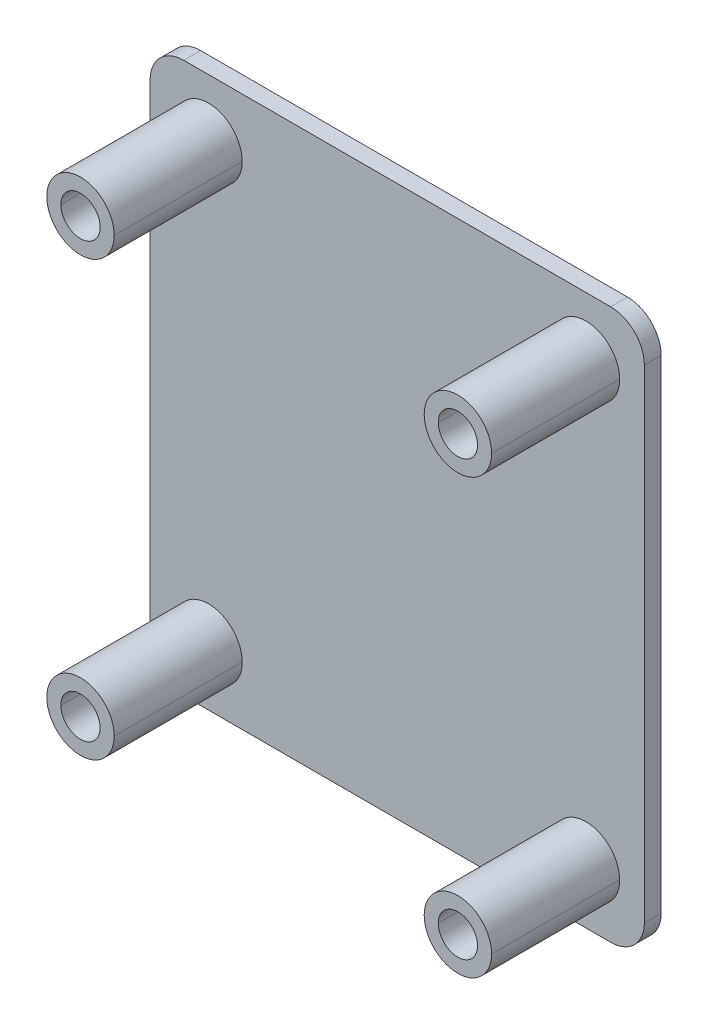
ISO-10303-21;
HEADER;
FILE_DESCRIPTION(('STEP AP214'),'2;1');
FILE_NAME('part.step','',(''),(''),'','','');
FILE_SCHEMA(('AUTOMOTIVE_DESIGN { 1 0 10303 214 1 1 1 1 }'));
ENDSEC;
DATA;
#1=APPLICATION_CONTEXT('core data for automotive mechanical design processes');
#2=APPLICATION_PROTOCOL_DEFINITION('international standard','automotive_design',2000,#1);
#3=PRODUCT_CONTEXT('',#1,'mechanical');
#4=PRODUCT('Part','Part','',(#3));
#5=PRODUCT_RELATED_PRODUCT_CATEGORY('part','',(#4));
#6=PRODUCT_DEFINITION_FORMATION('','',#4);
#7=PRODUCT_DEFINITION_CONTEXT('part definition',#1,'design');
#8=PRODUCT_DEFINITION('design','',#6,#7);
#9=PRODUCT_DEFINITION_SHAPE('','',#8);
#10=(LENGTH_UNIT() NAMED_UNIT(*) SI_UNIT(.MILLI.,.METRE.));
#11=(NAMED_UNIT(*) PLANE_ANGLE_UNIT() SI_UNIT($,.RADIAN.));
#12=(NAMED_UNIT(*) SI_UNIT($,.STERADIAN.) SOLID_ANGLE_UNIT());
#13=UNCERTAINTY_MEASURE_WITH_UNIT(LENGTH_MEASURE(1.E-05),#10,'distance_accuracy_value','');
#14=(GEOMETRIC_REPRESENTATION_CONTEXT(3) GLOBAL_UNCERTAINTY_ASSIGNED_CONTEXT((#13)) GLOBAL_UNIT_ASSIGNED_CONTEXT((#10,
#11,#12)) REPRESENTATION_CONTEXT('',''));
#15=CARTESIAN_POINT('',(0.,0.,0.));
#16=DIRECTION('',(0.,0.,1.));
#17=DIRECTION('',(1.,0.,0.));
#18=AXIS2_PLACEMENT_3D('',#15,#16,#17);
#19=CARTESIAN_POINT('',(5.2,43.8,12.9));
#20=DIRECTION('',(0.,0.,-1.));
#21=DIRECTION('',(-1.,0.,0.));
#22=AXIS2_PLACEMENT_3D('',#19,#20,#21);
#23=CYLINDRICAL_SURFACE('',#22,3.);
#24=DIRECTION('',(0.,0.,-1.));
#25=VECTOR('',#24,1.);
#26=CARTESIAN_POINT('',(8.2,43.8,12.9));
#27=LINE('',#26,#25);
#28=CARTESIAN_POINT('',(8.2,43.8,12.9));
#29=VERTEX_POINT('',#28);
#30=CARTESIAN_POINT('',(8.2,43.8,1.5));
#31=VERTEX_POINT('',#30);
#32=EDGE_CURVE('E239',#29,#31,#27,.T.);
#33=ORIENTED_EDGE('',*,*,#32,.F.);
#34=CARTESIAN_POINT('',(5.2,43.8,12.9));
#35=DIRECTION('',(0.,0.,1.));
#36=DIRECTION('',(1.,0.,0.));
#37=AXIS2_PLACEMENT_3D('',#34,#35,#36);
#38=CIRCLE('',#37,3.);
#39=CARTESIAN_POINT('',(2.2,43.8,12.9));
#40=VERTEX_POINT('',#39);
#41=EDGE_CURVE('E11',#40,#29,#38,.T.);
#42=ORIENTED_EDGE('',*,*,#41,.F.);
#43=DIRECTION('',(0.,0.,-1.));
#44=VECTOR('',#43,1.);
#45=CARTESIAN_POINT('',(2.2,43.8,12.9));
#46=LINE('',#45,#44);
#47=CARTESIAN_POINT('',(2.2,43.8,1.5));
#48=VERTEX_POINT('',#47);
#49=EDGE_CURVE('E248',#40,#48,#46,.T.);
#50=ORIENTED_EDGE('',*,*,#49,.T.);
#51=CARTESIAN_POINT('',(5.2,43.8,1.5));
#52=DIRECTION('',(0.,0.,1.));
#53=DIRECTION('',(-1.,0.,0.));
#54=AXIS2_PLACEMENT_3D('',#51,#52,#53);
#55=CIRCLE('',#54,3.);
#56=EDGE_CURVE('E240',#48,#31,#55,.T.);
#57=ORIENTED_EDGE('',*,*,#56,.T.);
#58=EDGE_LOOP('',(#33,#42,#50,#57));
#59=FACE_BOUND('',#58,.T.);
#60=ADVANCED_FACE('F16',(#59),#23,.T.);
#61=CARTESIAN_POINT('',(5.2,43.8,12.9));
#62=DIRECTION('',(0.,0.,1.));
#63=DIRECTION('',(1.,0.,0.));
#64=AXIS2_PLACEMENT_3D('',#61,#62,#63);
#65=PLANE('',#64);
#66=CARTESIAN_POINT('',(5.2,43.8,12.9));
#67=DIRECTION('',(0.,0.,1.));
#68=DIRECTION('',(1.,0.,0.));
#69=AXIS2_PLACEMENT_3D('',#66,#67,#68);
#70=CIRCLE('',#69,1.75);
#71=CARTESIAN_POINT('',(6.95,43.8,12.9));
#72=VERTEX_POINT('',#71);
#73=CARTESIAN_POINT('',(3.45,43.8,12.9));
#74=VERTEX_POINT('',#73);
#75=EDGE_CURVE('E279',#72,#74,#70,.T.);
#76=ORIENTED_EDGE('',*,*,#75,.F.);
#77=CARTESIAN_POINT('',(5.2,43.8,12.9));
#78=DIRECTION('',(0.,0.,1.));
#79=DIRECTION('',(1.,0.,0.));
#80=AXIS2_PLACEMENT_3D('',#77,#78,#79);
#81=CIRCLE('',#80,1.75);
#82=EDGE_CURVE('E346',#74,#72,#81,.T.);
#83=ORIENTED_EDGE('',*,*,#82,.F.);
#84=EDGE_LOOP('',(#76,#83));
#85=FACE_BOUND('',#84,.T.);
#86=ORIENTED_EDGE('',*,*,#41,.T.);
#87=CARTESIAN_POINT('',(5.2,43.8,12.9));
#88=DIRECTION('',(0.,0.,1.));
#89=DIRECTION('',(1.,0.,0.));
#90=AXIS2_PLACEMENT_3D('',#87,#88,#89);
#91=CIRCLE('',#90,3.);
#92=EDGE_CURVE('E234',#29,#40,#91,.T.);
#93=ORIENTED_EDGE('',*,*,#92,.T.);
#94=EDGE_LOOP('',(#86,#93));
#95=FACE_BOUND('',#94,.T.);
#96=ADVANCED_FACE('F232',(#85,#95),#65,.T.);
#97=CARTESIAN_POINT('',(38.8,43.8,12.9));
#98=DIRECTION('',(0.,0.,-1.));
#99=DIRECTION('',(-1.,0.,0.));
#100=AXIS2_PLACEMENT_3D('',#97,#98,#99);
#101=CYLINDRICAL_SURFACE('',#100,3.);
#102=DIRECTION('',(0.,0.,-1.));
#103=VECTOR('',#102,1.);
#104=CARTESIAN_POINT('',(41.8,43.8,12.9));
#105=LINE('',#104,#103);
#106=CARTESIAN_POINT('',(41.8,43.8,12.9));
#107=VERTEX_POINT('',#106);
#108=CARTESIAN_POINT('',(41.8,43.8,1.5));
#109=VERTEX_POINT('',#108);
#110=EDGE_CURVE('E287',#107,#109,#105,.T.);
#111=ORIENTED_EDGE('',*,*,#110,.F.);
#112=CARTESIAN_POINT('',(38.8,43.8,12.9));
#113=DIRECTION('',(0.,0.,1.));
#114=DIRECTION('',(-1.,0.,0.));
#115=AXIS2_PLACEMENT_3D('',#112,#113,#114);
#116=CIRCLE('',#115,3.);
#117=CARTESIAN_POINT('',(35.8,43.8,12.9));
#118=VERTEX_POINT('',#117);
#119=EDGE_CURVE('E24',#118,#107,#116,.T.);
#120=ORIENTED_EDGE('',*,*,#119,.F.);
#121=DIRECTION('',(0.,0.,-1.));
#122=VECTOR('',#121,1.);
#123=CARTESIAN_POINT('',(35.8,43.8,12.9));
#124=LINE('',#123,#122);
#125=CARTESIAN_POINT('',(35.8,43.8,1.5));
#126=VERTEX_POINT('',#125);
#127=EDGE_CURVE('E270',#118,#126,#124,.T.);
#128=ORIENTED_EDGE('',*,*,#127,.T.);
#129=CARTESIAN_POINT('',(38.8,43.8,1.5));
#130=DIRECTION('',(0.,0.,1.));
#131=DIRECTION('',(-1.,0.,0.));
#132=AXIS2_PLACEMENT_3D('',#129,#130,#131);
#133=CIRCLE('',#132,3.);
#134=EDGE_CURVE('E317',#126,#109,#133,.T.);
#135=ORIENTED_EDGE('',*,*,#134,.T.);
#136=EDGE_LOOP('',(#111,#120,#128,#135));
#137=FACE_BOUND('',#136,.T.);
#138=ADVANCED_FACE('F506',(#137),#101,.T.);
#139=CARTESIAN_POINT('',(38.8,43.8,12.9));
#140=DIRECTION('',(0.,0.,-1.));
#141=DIRECTION('',(0.,-1.,0.));
#142=AXIS2_PLACEMENT_3D('',#139,#140,#141);
#143=PLANE('',#142);
#144=CARTESIAN_POINT('',(38.8,43.8,12.9));
#145=DIRECTION('',(0.,0.,1.));
#146=DIRECTION('',(-1.,0.,0.));
#147=AXIS2_PLACEMENT_3D('',#144,#145,#146);
#148=CIRCLE('',#147,1.75);
#149=CARTESIAN_POINT('',(40.55,43.8,12.9));
#150=VERTEX_POINT('',#149);
#151=CARTESIAN_POINT('',(37.05,43.8,12.9));
#152=VERTEX_POINT('',#151);
#153=EDGE_CURVE('E433',#150,#152,#148,.T.);
#154=ORIENTED_EDGE('',*,*,#153,.F.);
#155=CARTESIAN_POINT('',(38.8,43.8,12.9));
#156=DIRECTION('',(0.,0.,1.));
#157=DIRECTION('',(-1.,0.,0.));
#158=AXIS2_PLACEMENT_3D('',#155,#156,#157);
#159=CIRCLE('',#158,1.75);
#160=EDGE_CURVE('E379',#152,#150,#159,.T.);
#161=ORIENTED_EDGE('',*,*,#160,.F.);
#162=EDGE_LOOP('',(#154,#161));
#163=FACE_BOUND('',#162,.T.);
#164=ORIENTED_EDGE('',*,*,#119,.T.);
#165=CARTESIAN_POINT('',(38.8,43.8,12.9));
#166=DIRECTION('',(0.,0.,1.));
#167=DIRECTION('',(-1.,0.,0.));
#168=AXIS2_PLACEMENT_3D('',#165,#166,#167);
#169=CIRCLE('',#168,3.);
#170=EDGE_CURVE('E283',#107,#118,#169,.T.);
#171=ORIENTED_EDGE('',*,*,#170,.T.);
#172=EDGE_LOOP('',(#164,#171));
#173=FACE_BOUND('',#172,.T.);
#174=ADVANCED_FACE('F502',(#163,#173),#143,.F.);
#175=CARTESIAN_POINT('',(38.8,5.2,12.9));
#176=DIRECTION('',(0.,0.,-1.));
#177=DIRECTION('',(-1.,0.,0.));
#178=AXIS2_PLACEMENT_3D('',#175,#176,#177);
#179=CYLINDRICAL_SURFACE('',#178,3.);
#180=DIRECTION('',(0.,0.,-1.));
#181=VECTOR('',#180,1.);
#182=CARTESIAN_POINT('',(41.8,5.2,12.9));
#183=LINE('',#182,#181);
#184=CARTESIAN_POINT('',(41.8,5.2,12.9));
#185=VERTEX_POINT('',#184);
#186=CARTESIAN_POINT('',(41.8,5.2,1.5));
#187=VERTEX_POINT('',#186);
#188=EDGE_CURVE('E313',#185,#187,#183,.T.);
#189=ORIENTED_EDGE('',*,*,#188,.F.);
#190=CARTESIAN_POINT('',(38.8,5.2,12.9));
#191=DIRECTION('',(0.,0.,1.));
#192=DIRECTION('',(1.,0.,0.));
#193=AXIS2_PLACEMENT_3D('',#190,#191,#192);
#194=CIRCLE('',#193,3.);
#195=CARTESIAN_POINT('',(35.8,5.2,12.9));
#196=VERTEX_POINT('',#195);
#197=EDGE_CURVE('E496',#196,#185,#194,.T.);
#198=ORIENTED_EDGE('',*,*,#197,.F.);
#199=DIRECTION('',(0.,0.,-1.));
#200=VECTOR('',#199,1.);
#201=CARTESIAN_POINT('',(35.8,5.2,12.9));
#202=LINE('',#201,#200);
#203=CARTESIAN_POINT('',(35.8,5.2,1.5));
#204=VERTEX_POINT('',#203);
#205=EDGE_CURVE('E302',#196,#204,#202,.T.);
#206=ORIENTED_EDGE('',*,*,#205,.T.);
#207=CARTESIAN_POINT('',(38.8,5.2,1.5));
#208=DIRECTION('',(0.,0.,1.));
#209=DIRECTION('',(-1.,0.,0.));
#210=AXIS2_PLACEMENT_3D('',#207,#208,#209);
#211=CIRCLE('',#210,3.);
#212=EDGE_CURVE('E412',#204,#187,#211,.T.);
#213=ORIENTED_EDGE('',*,*,#212,.T.);
#214=EDGE_LOOP('',(#189,#198,#206,#213));
#215=FACE_BOUND('',#214,.T.);
#216=ADVANCED_FACE('F1080',(#215),#179,.T.);
#217=CARTESIAN_POINT('',(38.8,5.2,12.9));
#218=DIRECTION('',(0.,0.,1.));
#219=DIRECTION('',(1.,0.,0.));
#220=AXIS2_PLACEMENT_3D('',#217,#218,#219);
#221=PLANE('',#220);
#222=CARTESIAN_POINT('',(38.8,5.2,12.9));
#223=DIRECTION('',(0.,0.,1.));
#224=DIRECTION('',(1.,0.,0.));
#225=AXIS2_PLACEMENT_3D('',#222,#223,#224);
#226=CIRCLE('',#225,1.75);
#227=CARTESIAN_POINT('',(40.55,5.2,12.9));
#228=VERTEX_POINT('',#227);
#229=CARTESIAN_POINT('',(37.05,5.2,12.9));
#230=VERTEX_POINT('',#229);
#231=EDGE_CURVE('E429',#228,#230,#226,.T.);
#232=ORIENTED_EDGE('',*,*,#231,.F.);
#233=CARTESIAN_POINT('',(38.8,5.2,12.9));
#234=DIRECTION('',(0.,0.,1.));
#235=DIRECTION('',(1.,0.,0.));
#236=AXIS2_PLACEMENT_3D('',#233,#234,#235);
#237=CIRCLE('',#236,1.75);
#238=EDGE_CURVE('E363',#230,#228,#237,.T.);
#239=ORIENTED_EDGE('',*,*,#238,.F.);
#240=EDGE_LOOP('',(#232,#239));
#241=FACE_BOUND('',#240,.T.);
#242=ORIENTED_EDGE('',*,*,#197,.T.);
#243=CARTESIAN_POINT('',(38.8,5.2,12.9));
#244=DIRECTION('',(0.,0.,1.));
#245=DIRECTION('',(1.,0.,0.));
#246=AXIS2_PLACEMENT_3D('',#243,#244,#245);
#247=CIRCLE('',#246,3.);
#248=EDGE_CURVE('E274',#185,#196,#247,.T.);
#249=ORIENTED_EDGE('',*,*,#248,.T.);
#250=EDGE_LOOP('',(#242,#249));
#251=FACE_BOUND('',#250,.T.);
#252=ADVANCED_FACE('F1075',(#241,#251),#221,.T.);
#253=CARTESIAN_POINT('',(5.2,5.2,12.9));
#254=DIRECTION('',(0.,0.,-1.));
#255=DIRECTION('',(-1.,0.,0.));
#256=AXIS2_PLACEMENT_3D('',#253,#254,#255);
#257=CYLINDRICAL_SURFACE('',#256,3.);
#258=DIRECTION('',(0.,0.,-1.));
#259=VECTOR('',#258,1.);
#260=CARTESIAN_POINT('',(8.2,5.2,12.9));
#261=LINE('',#260,#259);
#262=CARTESIAN_POINT('',(8.2,5.2,12.9));
#263=VERTEX_POINT('',#262);
#264=CARTESIAN_POINT('',(8.2,5.2,1.5));
#265=VERTEX_POINT('',#264);
#266=EDGE_CURVE('E256',#263,#265,#261,.T.);
#267=ORIENTED_EDGE('',*,*,#266,.F.);
#268=CARTESIAN_POINT('',(5.2,5.2,12.9));
#269=DIRECTION('',(0.,0.,1.));
#270=DIRECTION('',(-1.,0.,0.));
#271=AXIS2_PLACEMENT_3D('',#268,#269,#270);
#272=CIRCLE('',#271,3.);
#273=CARTESIAN_POINT('',(2.2,5.2,12.9));
#274=VERTEX_POINT('',#273);
#275=EDGE_CURVE('E493',#274,#263,#272,.T.);
#276=ORIENTED_EDGE('',*,*,#275,.F.);
#277=DIRECTION('',(0.,0.,-1.));
#278=VECTOR('',#277,1.);
#279=CARTESIAN_POINT('',(2.2,5.2,12.9));
#280=LINE('',#279,#278);
#281=CARTESIAN_POINT('',(2.2,5.2,1.5));
#282=VERTEX_POINT('',#281);
#283=EDGE_CURVE('E291',#274,#282,#280,.T.);
#284=ORIENTED_EDGE('',*,*,#283,.T.);
#285=CARTESIAN_POINT('',(5.2,5.2,1.5));
#286=DIRECTION('',(0.,0.,1.));
#287=DIRECTION('',(-1.,0.,0.));
#288=AXIS2_PLACEMENT_3D('',#285,#286,#287);
#289=CIRCLE('',#288,3.);
#290=EDGE_CURVE('E320',#282,#265,#289,.T.);
#291=ORIENTED_EDGE('',*,*,#290,.T.);
#292=EDGE_LOOP('',(#267,#276,#284,#291));
#293=FACE_BOUND('',#292,.T.);
#294=ADVANCED_FACE('F1079',(#293),#257,.T.);
#295=CARTESIAN_POINT('',(5.2,5.2,12.9));
#296=DIRECTION('',(0.,0.,-1.));
#297=DIRECTION('',(0.,-1.,0.));
#298=AXIS2_PLACEMENT_3D('',#295,#296,#297);
#299=PLANE('',#298);
#300=CARTESIAN_POINT('',(5.2,5.2,12.9));
#301=DIRECTION('',(0.,0.,1.));
#302=DIRECTION('',(-1.,0.,0.));
#303=AXIS2_PLACEMENT_3D('',#300,#301,#302);
#304=CIRCLE('',#303,1.75);
#305=CARTESIAN_POINT('',(6.95,5.2,12.9));
#306=VERTEX_POINT('',#305);
#307=CARTESIAN_POINT('',(3.45,5.2,12.9));
#308=VERTEX_POINT('',#307);
#309=EDGE_CURVE('E432',#306,#308,#304,.T.);
#310=ORIENTED_EDGE('',*,*,#309,.F.);
#311=CARTESIAN_POINT('',(5.2,5.2,12.9));
#312=DIRECTION('',(0.,0.,1.));
#313=DIRECTION('',(-1.,0.,0.));
#314=AXIS2_PLACEMENT_3D('',#311,#312,#313);
#315=CIRCLE('',#314,1.75);
#316=EDGE_CURVE('E337',#308,#306,#315,.T.);
#317=ORIENTED_EDGE('',*,*,#316,.F.);
#318=EDGE_LOOP('',(#310,#317));
#319=FACE_BOUND('',#318,.T.);
#320=ORIENTED_EDGE('',*,*,#275,.T.);
#321=CARTESIAN_POINT('',(5.2,5.2,12.9));
#322=DIRECTION('',(0.,0.,1.));
#323=DIRECTION('',(-1.,0.,0.));
#324=AXIS2_PLACEMENT_3D('',#321,#322,#323);
#325=CIRCLE('',#324,3.);
#326=EDGE_CURVE('E260',#263,#274,#325,.T.);
#327=ORIENTED_EDGE('',*,*,#326,.T.);
#328=EDGE_LOOP('',(#320,#327));
#329=FACE_BOUND('',#328,.T.);
#330=ADVANCED_FACE('F1187',(#319,#329),#299,.F.);
#331=CARTESIAN_POINT('',(5.2,5.2,-4.94974746830584));
#332=DIRECTION('',(0.,0.,1.));
#333=DIRECTION('',(1.,0.,0.));
#334=AXIS2_PLACEMENT_3D('',#331,#332,#333);
#335=CYLINDRICAL_SURFACE('',#334,1.75);
#336=DIRECTION('',(0.,0.,1.));
#337=VECTOR('',#336,1.);
#338=CARTESIAN_POINT('',(3.45,5.2,-4.94974746830584));
#339=LINE('',#338,#337);
#340=CARTESIAN_POINT('',(3.45,5.2,0.));
#341=VERTEX_POINT('',#340);
#342=EDGE_CURVE('E333',#341,#308,#339,.T.);
#343=ORIENTED_EDGE('',*,*,#342,.F.);
#344=CARTESIAN_POINT('',(5.2,5.2,0.));
#345=DIRECTION('',(0.,0.,1.));
#346=DIRECTION('',(-1.,0.,0.));
#347=AXIS2_PLACEMENT_3D('',#344,#345,#346);
#348=CIRCLE('',#347,1.75);
#349=CARTESIAN_POINT('',(6.95,5.2,0.));
#350=VERTEX_POINT('',#349);
#351=EDGE_CURVE('E352',#350,#341,#348,.T.);
#352=ORIENTED_EDGE('',*,*,#351,.F.);
#353=DIRECTION('',(0.,0.,1.));
#354=VECTOR('',#353,1.);
#355=CARTESIAN_POINT('',(6.95,5.2,-4.94974746830584));
#356=LINE('',#355,#354);
#357=EDGE_CURVE('E341',#350,#306,#356,.T.);
#358=ORIENTED_EDGE('',*,*,#357,.T.);
#359=ORIENTED_EDGE('',*,*,#309,.T.);
#360=EDGE_LOOP('',(#343,#352,#358,#359));
#361=FACE_BOUND('',#360,.T.);
#362=ADVANCED_FACE('F1176',(#361),#335,.F.);
#363=CARTESIAN_POINT('',(38.8,5.2,-4.94974746830584));
#364=DIRECTION('',(0.,0.,1.));
#365=DIRECTION('',(1.,0.,0.));
#366=AXIS2_PLACEMENT_3D('',#363,#364,#365);
#367=CYLINDRICAL_SURFACE('',#366,1.75);
#368=DIRECTION('',(0.,0.,1.));
#369=VECTOR('',#368,1.);
#370=CARTESIAN_POINT('',(37.05,5.2,-4.94974746830584));
#371=LINE('',#370,#369);
#372=CARTESIAN_POINT('',(37.05,5.2,0.));
#373=VERTEX_POINT('',#372);
#374=EDGE_CURVE('E359',#373,#230,#371,.T.);
#375=ORIENTED_EDGE('',*,*,#374,.F.);
#376=CARTESIAN_POINT('',(38.8,5.2,0.));
#377=DIRECTION('',(0.,0.,1.));
#378=DIRECTION('',(-1.,0.,0.));
#379=AXIS2_PLACEMENT_3D('',#376,#377,#378);
#380=CIRCLE('',#379,1.75);
#381=CARTESIAN_POINT('',(40.55,5.2,0.));
#382=VERTEX_POINT('',#381);
#383=EDGE_CURVE('E355',#382,#373,#380,.T.);
#384=ORIENTED_EDGE('',*,*,#383,.F.);
#385=DIRECTION('',(0.,0.,1.));
#386=VECTOR('',#385,1.);
#387=CARTESIAN_POINT('',(40.55,5.2,-4.94974746830584));
#388=LINE('',#387,#386);
#389=EDGE_CURVE('E367',#382,#228,#388,.T.);
#390=ORIENTED_EDGE('',*,*,#389,.T.);
#391=ORIENTED_EDGE('',*,*,#231,.T.);
#392=EDGE_LOOP('',(#375,#384,#390,#391));
#393=FACE_BOUND('',#392,.T.);
#394=ADVANCED_FACE('F1165',(#393),#367,.F.);
#395=CARTESIAN_POINT('',(38.8,43.8,-4.94974746830584));
#396=DIRECTION('',(0.,0.,1.));
#397=DIRECTION('',(1.,0.,0.));
#398=AXIS2_PLACEMENT_3D('',#395,#396,#397);
#399=CYLINDRICAL_SURFACE('',#398,1.75);
#400=DIRECTION('',(0.,0.,1.));
#401=VECTOR('',#400,1.);
#402=CARTESIAN_POINT('',(37.05,43.8,-4.94974746830584));
#403=LINE('',#402,#401);
#404=CARTESIAN_POINT('',(37.05,43.8,0.));
#405=VERTEX_POINT('',#404);
#406=EDGE_CURVE('E375',#405,#152,#403,.T.);
#407=ORIENTED_EDGE('',*,*,#406,.F.);
#408=CARTESIAN_POINT('',(38.8,43.8,0.));
#409=DIRECTION('',(0.,0.,1.));
#410=DIRECTION('',(-1.,0.,0.));
#411=AXIS2_PLACEMENT_3D('',#408,#409,#410);
#412=CIRCLE('',#411,1.75);
#413=CARTESIAN_POINT('',(40.55,43.8,0.));
#414=VERTEX_POINT('',#413);
#415=EDGE_CURVE('E280',#414,#405,#412,.T.);
#416=ORIENTED_EDGE('',*,*,#415,.F.);
#417=DIRECTION('',(0.,0.,1.));
#418=VECTOR('',#417,1.);
#419=CARTESIAN_POINT('',(40.55,43.8,-4.94974746830584));
#420=LINE('',#419,#418);
#421=EDGE_CURVE('E383',#414,#150,#420,.T.);
#422=ORIENTED_EDGE('',*,*,#421,.T.);
#423=ORIENTED_EDGE('',*,*,#153,.T.);
#424=EDGE_LOOP('',(#407,#416,#422,#423));
#425=FACE_BOUND('',#424,.T.);
#426=ADVANCED_FACE('F998',(#425),#399,.F.);
#427=CARTESIAN_POINT('',(5.2,43.8,-4.94974746830584));
#428=DIRECTION('',(0.,0.,1.));
#429=DIRECTION('',(1.,0.,0.));
#430=AXIS2_PLACEMENT_3D('',#427,#428,#429);
#431=CYLINDRICAL_SURFACE('',#430,1.75);
#432=DIRECTION('',(0.,0.,1.));
#433=VECTOR('',#432,1.);
#434=CARTESIAN_POINT('',(3.45,43.8,-4.94974746830584));
#435=LINE('',#434,#433);
#436=CARTESIAN_POINT('',(3.45,43.8,0.));
#437=VERTEX_POINT('',#436);
#438=EDGE_CURVE('E342',#437,#74,#435,.T.);
#439=ORIENTED_EDGE('',*,*,#438,.F.);
#440=CARTESIAN_POINT('',(5.2,43.8,0.));
#441=DIRECTION('',(0.,0.,1.));
#442=DIRECTION('',(-1.,0.,0.));
#443=AXIS2_PLACEMENT_3D('',#440,#441,#442);
#444=CIRCLE('',#443,1.75);
#445=CARTESIAN_POINT('',(6.95,43.8,0.));
#446=VERTEX_POINT('',#445);
#447=EDGE_CURVE('E276',#446,#437,#444,.T.);
#448=ORIENTED_EDGE('',*,*,#447,.F.);
#449=DIRECTION('',(0.,0.,1.));
#450=VECTOR('',#449,1.);
#451=CARTESIAN_POINT('',(6.95,43.8,-4.94974746830584));
#452=LINE('',#451,#450);
#453=EDGE_CURVE('E393',#446,#72,#452,.T.);
#454=ORIENTED_EDGE('',*,*,#453,.T.);
#455=ORIENTED_EDGE('',*,*,#75,.T.);
#456=EDGE_LOOP('',(#439,#448,#454,#455));
#457=FACE_BOUND('',#456,.T.);
#458=ADVANCED_FACE('F977',(#457),#431,.F.);
#459=CARTESIAN_POINT('',(3.,3.,0.));
#460=DIRECTION('',(0.,0.,-1.));
#461=DIRECTION('',(0.,-1.,0.));
#462=AXIS2_PLACEMENT_3D('',#459,#460,#461);
#463=PLANE('',#462);
#464=ORIENTED_EDGE('',*,*,#447,.T.);
#465=CARTESIAN_POINT('',(5.2,43.8,0.));
#466=DIRECTION('',(0.,0.,1.));
#467=DIRECTION('',(-1.,0.,0.));
#468=AXIS2_PLACEMENT_3D('',#465,#466,#467);
#469=CIRCLE('',#468,1.75);
#470=EDGE_CURVE('E347',#437,#446,#469,.T.);
#471=ORIENTED_EDGE('',*,*,#470,.T.);
#472=EDGE_LOOP('',(#464,#471));
#473=FACE_BOUND('',#472,.T.);
#474=ORIENTED_EDGE('',*,*,#415,.T.);
#475=CARTESIAN_POINT('',(38.8,43.8,0.));
#476=DIRECTION('',(0.,0.,1.));
#477=DIRECTION('',(-1.,0.,0.));
#478=AXIS2_PLACEMENT_3D('',#475,#476,#477);
#479=CIRCLE('',#478,1.75);
#480=EDGE_CURVE('E371',#405,#414,#479,.T.);
#481=ORIENTED_EDGE('',*,*,#480,.T.);
#482=EDGE_LOOP('',(#474,#481));
#483=FACE_BOUND('',#482,.T.);
#484=ORIENTED_EDGE('',*,*,#383,.T.);
#485=CARTESIAN_POINT('',(38.8,5.2,0.));
#486=DIRECTION('',(0.,0.,1.));
#487=DIRECTION('',(-1.,0.,0.));
#488=AXIS2_PLACEMENT_3D('',#485,#486,#487);
#489=CIRCLE('',#488,1.75);
#490=EDGE_CURVE('E351',#373,#382,#489,.T.);
#491=ORIENTED_EDGE('',*,*,#490,.T.);
#492=EDGE_LOOP('',(#484,#491));
#493=FACE_BOUND('',#492,.T.);
#494=ORIENTED_EDGE('',*,*,#351,.T.);
#495=CARTESIAN_POINT('',(5.2,5.2,0.));
#496=DIRECTION('',(0.,0.,1.));
#497=DIRECTION('',(-1.,0.,0.));
#498=AXIS2_PLACEMENT_3D('',#495,#496,#497);
#499=CIRCLE('',#498,1.75);
#500=EDGE_CURVE('E295',#341,#350,#499,.T.);
#501=ORIENTED_EDGE('',*,*,#500,.T.);
#502=EDGE_LOOP('',(#494,#501));
#503=FACE_BOUND('',#502,.T.);
#504=CARTESIAN_POINT('',(3.,3.,0.));
#505=DIRECTION('',(0.,0.,1.));
#506=DIRECTION('',(-1.,0.,0.));
#507=AXIS2_PLACEMENT_3D('',#504,#505,#506);
#508=CIRCLE('',#507,3.);
#509=CARTESIAN_POINT('',(0.,3.,0.));
#510=VERTEX_POINT('',#509);
#511=CARTESIAN_POINT('',(3.,0.,0.));
#512=VERTEX_POINT('',#511);
#513=EDGE_CURVE('E405',#510,#512,#508,.T.);
#514=ORIENTED_EDGE('',*,*,#513,.F.);
#515=DIRECTION('',(0.,-1.,0.));
#516=VECTOR('',#515,1.);
#517=CARTESIAN_POINT('',(0.,3.,0.));
#518=LINE('',#517,#516);
#519=CARTESIAN_POINT('',(0.,46.,0.));
#520=VERTEX_POINT('',#519);
#521=EDGE_CURVE('E37',#520,#510,#518,.T.);
#522=ORIENTED_EDGE('',*,*,#521,.F.);
#523=CARTESIAN_POINT('',(3.,46.,0.));
#524=DIRECTION('',(0.,0.,1.));
#525=DIRECTION('',(-1.,0.,0.));
#526=AXIS2_PLACEMENT_3D('',#523,#524,#525);
#527=CIRCLE('',#526,3.);
#528=CARTESIAN_POINT('',(3.,49.,0.));
#529=VERTEX_POINT('',#528);
#530=EDGE_CURVE('E45',#529,#520,#527,.T.);
#531=ORIENTED_EDGE('',*,*,#530,.F.);
#532=DIRECTION('',(-1.,0.,0.));
#533=VECTOR('',#532,1.);
#534=CARTESIAN_POINT('',(3.,49.,0.));
#535=LINE('',#534,#533);
#536=CARTESIAN_POINT('',(41.,49.,0.));
#537=VERTEX_POINT('',#536);
#538=EDGE_CURVE('E465',#537,#529,#535,.T.);
#539=ORIENTED_EDGE('',*,*,#538,.F.);
#540=CARTESIAN_POINT('',(41.,46.,0.));
#541=DIRECTION('',(0.,0.,1.));
#542=DIRECTION('',(-1.,0.,0.));
#543=AXIS2_PLACEMENT_3D('',#540,#541,#542);
#544=CIRCLE('',#543,3.);
#545=CARTESIAN_POINT('',(44.,46.,0.));
#546=VERTEX_POINT('',#545);
#547=EDGE_CURVE('E444',#546,#537,#544,.T.);
#548=ORIENTED_EDGE('',*,*,#547,.F.);
#549=DIRECTION('',(0.,1.,0.));
#550=VECTOR('',#549,1.);
#551=CARTESIAN_POINT('',(44.,3.,0.));
#552=LINE('',#551,#550);
#553=CARTESIAN_POINT('',(44.,3.,0.));
#554=VERTEX_POINT('',#553);
#555=EDGE_CURVE('E445',#554,#546,#552,.T.);
#556=ORIENTED_EDGE('',*,*,#555,.F.);
#557=CARTESIAN_POINT('',(41.,3.,0.));
#558=DIRECTION('',(0.,0.,1.));
#559=DIRECTION('',(1.,0.,0.));
#560=AXIS2_PLACEMENT_3D('',#557,#558,#559);
#561=CIRCLE('',#560,3.);
#562=CARTESIAN_POINT('',(41.,0.,0.));
#563=VERTEX_POINT('',#562);
#564=EDGE_CURVE('E303',#563,#554,#561,.T.);
#565=ORIENTED_EDGE('',*,*,#564,.F.);
#566=DIRECTION('',(1.,0.,0.));
#567=VECTOR('',#566,1.);
#568=CARTESIAN_POINT('',(3.,0.,0.));
#569=LINE('',#568,#567);
#570=EDGE_CURVE('E449',#512,#563,#569,.T.);
#571=ORIENTED_EDGE('',*,*,#570,.F.);
#572=EDGE_LOOP('',(#514,#522,#531,#539,#548,#556,#565,#571));
#573=FACE_BOUND('',#572,.T.);
#574=ADVANCED_FACE('F973',(#473,#483,#493,#503,#573),#463,.T.);
#575=CARTESIAN_POINT('',(0.,3.,1.5));
#576=DIRECTION('',(1.,0.,0.));
#577=DIRECTION('',(0.,1.,0.));
#578=AXIS2_PLACEMENT_3D('',#575,#576,#577);
#579=PLANE('',#578);
#580=ORIENTED_EDGE('',*,*,#521,.T.);
#581=DIRECTION('',(0.,0.,-1.));
#582=VECTOR('',#581,1.);
#583=CARTESIAN_POINT('',(0.,3.,1.5));
#584=LINE('',#583,#582);
#585=CARTESIAN_POINT('',(0.,3.,1.5));
#586=VERTEX_POINT('',#585);
#587=EDGE_CURVE('E439',#586,#510,#584,.T.);
#588=ORIENTED_EDGE('',*,*,#587,.F.);
#589=DIRECTION('',(0.,-1.,0.));
#590=VECTOR('',#589,1.);
#591=CARTESIAN_POINT('',(0.,3.,1.5));
#592=LINE('',#591,#590);
#593=CARTESIAN_POINT('',(0.,46.,1.5));
#594=VERTEX_POINT('',#593);
#595=EDGE_CURVE('E255',#594,#586,#592,.T.);
#596=ORIENTED_EDGE('',*,*,#595,.F.);
#597=DIRECTION('',(0.,0.,-1.));
#598=VECTOR('',#597,1.);
#599=CARTESIAN_POINT('',(0.,46.,1.5));
#600=LINE('',#599,#598);
#601=EDGE_CURVE('E478',#594,#520,#600,.T.);
#602=ORIENTED_EDGE('',*,*,#601,.T.);
#603=EDGE_LOOP('',(#580,#588,#596,#602));
#604=FACE_BOUND('',#603,.T.);
#605=ADVANCED_FACE('F544',(#604),#579,.F.);
#606=CARTESIAN_POINT('',(3.,46.,1.5));
#607=DIRECTION('',(0.,0.,-1.));
#608=DIRECTION('',(-1.,0.,0.));
#609=AXIS2_PLACEMENT_3D('',#606,#607,#608);
#610=CYLINDRICAL_SURFACE('',#609,3.);
#611=ORIENTED_EDGE('',*,*,#530,.T.);
#612=ORIENTED_EDGE('',*,*,#601,.F.);
#613=CARTESIAN_POINT('',(3.,46.,1.5));
#614=DIRECTION('',(0.,0.,1.));
#615=DIRECTION('',(-1.,0.,0.));
#616=AXIS2_PLACEMENT_3D('',#613,#614,#615);
#617=CIRCLE('',#616,3.);
#618=CARTESIAN_POINT('',(3.,49.,1.5));
#619=VERTEX_POINT('',#618);
#620=EDGE_CURVE('E423',#619,#594,#617,.T.);
#621=ORIENTED_EDGE('',*,*,#620,.F.);
#622=DIRECTION('',(0.,0.,-1.));
#623=VECTOR('',#622,1.);
#624=CARTESIAN_POINT('',(3.,49.,1.5));
#625=LINE('',#624,#623);
#626=EDGE_CURVE('E462',#619,#529,#625,.T.);
#627=ORIENTED_EDGE('',*,*,#626,.T.);
#628=EDGE_LOOP('',(#611,#612,#621,#627));
#629=FACE_BOUND('',#628,.T.);
#630=ADVANCED_FACE('F542',(#629),#610,.T.);
#631=CARTESIAN_POINT('',(3.,49.,1.5));
#632=DIRECTION('',(0.,-1.,0.));
#633=DIRECTION('',(0.,0.,-1.));
#634=AXIS2_PLACEMENT_3D('',#631,#632,#633);
#635=PLANE('',#634);
#636=ORIENTED_EDGE('',*,*,#538,.T.);
#637=ORIENTED_EDGE('',*,*,#626,.F.);
#638=DIRECTION('',(-1.,0.,0.));
#639=VECTOR('',#638,1.);
#640=CARTESIAN_POINT('',(3.,49.,1.5));
#641=LINE('',#640,#639);
#642=CARTESIAN_POINT('',(41.,49.,1.5));
#643=VERTEX_POINT('',#642);
#644=EDGE_CURVE('E419',#643,#619,#641,.T.);
#645=ORIENTED_EDGE('',*,*,#644,.F.);
#646=DIRECTION('',(0.,0.,-1.));
#647=VECTOR('',#646,1.);
#648=CARTESIAN_POINT('',(41.,49.,1.5));
#649=LINE('',#648,#647);
#650=EDGE_CURVE('E469',#643,#537,#649,.T.);
#651=ORIENTED_EDGE('',*,*,#650,.T.);
#652=EDGE_LOOP('',(#636,#637,#645,#651));
#653=FACE_BOUND('',#652,.T.);
#654=ADVANCED_FACE('F539',(#653),#635,.F.);
#655=CARTESIAN_POINT('',(41.,46.,1.5));
#656=DIRECTION('',(0.,0.,-1.));
#657=DIRECTION('',(-1.,0.,0.));
#658=AXIS2_PLACEMENT_3D('',#655,#656,#657);
#659=CYLINDRICAL_SURFACE('',#658,3.);
#660=ORIENTED_EDGE('',*,*,#547,.T.);
#661=ORIENTED_EDGE('',*,*,#650,.F.);
#662=CARTESIAN_POINT('',(41.,46.,1.5));
#663=DIRECTION('',(0.,0.,1.));
#664=DIRECTION('',(-1.,0.,0.));
#665=AXIS2_PLACEMENT_3D('',#662,#663,#664);
#666=CIRCLE('',#665,3.);
#667=CARTESIAN_POINT('',(44.,46.,1.5));
#668=VERTEX_POINT('',#667);
#669=EDGE_CURVE('E266',#668,#643,#666,.T.);
#670=ORIENTED_EDGE('',*,*,#669,.F.);
#671=DIRECTION('',(0.,0.,-1.));
#672=VECTOR('',#671,1.);
#673=CARTESIAN_POINT('',(44.,46.,1.5));
#674=LINE('',#673,#672);
#675=EDGE_CURVE('E440',#668,#546,#674,.T.);
#676=ORIENTED_EDGE('',*,*,#675,.T.);
#677=EDGE_LOOP('',(#660,#661,#670,#676));
#678=FACE_BOUND('',#677,.T.);
#679=ADVANCED_FACE('F536',(#678),#659,.T.);
#680=CARTESIAN_POINT('',(44.,3.,1.5));
#681=DIRECTION('',(-1.,0.,0.));
#682=DIRECTION('',(0.,1.,0.));
#683=AXIS2_PLACEMENT_3D('',#680,#681,#682);
#684=PLANE('',#683);
#685=ORIENTED_EDGE('',*,*,#555,.T.);
#686=ORIENTED_EDGE('',*,*,#675,.F.);
#687=DIRECTION('',(0.,1.,0.));
#688=VECTOR('',#687,1.);
#689=CARTESIAN_POINT('',(44.,3.,1.5));
#690=LINE('',#689,#688);
#691=CARTESIAN_POINT('',(44.,3.,1.5));
#692=VERTEX_POINT('',#691);
#693=EDGE_CURVE('E262',#692,#668,#690,.T.);
#694=ORIENTED_EDGE('',*,*,#693,.F.);
#695=DIRECTION('',(0.,0.,-1.));
#696=VECTOR('',#695,1.);
#697=CARTESIAN_POINT('',(44.,3.,1.5));
#698=LINE('',#697,#696);
#699=EDGE_CURVE('E307',#692,#554,#698,.T.);
#700=ORIENTED_EDGE('',*,*,#699,.T.);
#701=EDGE_LOOP('',(#685,#686,#694,#700));
#702=FACE_BOUND('',#701,.T.);
#703=ADVANCED_FACE('F534',(#702),#684,.F.);
#704=CARTESIAN_POINT('',(41.,3.,1.5));
#705=DIRECTION('',(0.,0.,-1.));
#706=DIRECTION('',(-1.,0.,0.));
#707=AXIS2_PLACEMENT_3D('',#704,#705,#706);
#708=CYLINDRICAL_SURFACE('',#707,3.);
#709=ORIENTED_EDGE('',*,*,#564,.T.);
#710=ORIENTED_EDGE('',*,*,#699,.F.);
#711=CARTESIAN_POINT('',(41.,3.,1.5));
#712=DIRECTION('',(0.,0.,1.));
#713=DIRECTION('',(1.,0.,0.));
#714=AXIS2_PLACEMENT_3D('',#711,#712,#713);
#715=CIRCLE('',#714,3.);
#716=CARTESIAN_POINT('',(41.,0.,1.5));
#717=VERTEX_POINT('',#716);
#718=EDGE_CURVE('E267',#717,#692,#715,.T.);
#719=ORIENTED_EDGE('',*,*,#718,.F.);
#720=DIRECTION('',(0.,0.,-1.));
#721=VECTOR('',#720,1.);
#722=CARTESIAN_POINT('',(41.,0.,1.5));
#723=LINE('',#722,#721);
#724=EDGE_CURVE('E308',#717,#563,#723,.T.);
#725=ORIENTED_EDGE('',*,*,#724,.T.);
#726=EDGE_LOOP('',(#709,#710,#719,#725));
#727=FACE_BOUND('',#726,.T.);
#728=ADVANCED_FACE('F530',(#727),#708,.T.);
#729=CARTESIAN_POINT('',(3.,0.,1.5));
#730=DIRECTION('',(0.,1.,0.));
#731=DIRECTION('',(1.,0.,0.));
#732=AXIS2_PLACEMENT_3D('',#729,#730,#731);
#733=PLANE('',#732);
#734=ORIENTED_EDGE('',*,*,#570,.T.);
#735=ORIENTED_EDGE('',*,*,#724,.F.);
#736=DIRECTION('',(1.,0.,0.));
#737=VECTOR('',#736,1.);
#738=CARTESIAN_POINT('',(3.,0.,1.5));
#739=LINE('',#738,#737);
#740=CARTESIAN_POINT('',(3.,0.,1.5));
#741=VERTEX_POINT('',#740);
#742=EDGE_CURVE('E401',#741,#717,#739,.T.);
#743=ORIENTED_EDGE('',*,*,#742,.F.);
#744=DIRECTION('',(0.,0.,-1.));
#745=VECTOR('',#744,1.);
#746=CARTESIAN_POINT('',(3.,0.,1.5));
#747=LINE('',#746,#745);
#748=EDGE_CURVE('E409',#741,#512,#747,.T.);
#749=ORIENTED_EDGE('',*,*,#748,.T.);
#750=EDGE_LOOP('',(#734,#735,#743,#749));
#751=FACE_BOUND('',#750,.T.);
#752=ADVANCED_FACE('F527',(#751),#733,.F.);
#753=CARTESIAN_POINT('',(3.,3.,1.5));
#754=DIRECTION('',(0.,0.,-1.));
#755=DIRECTION('',(-1.,0.,0.));
#756=AXIS2_PLACEMENT_3D('',#753,#754,#755);
#757=CYLINDRICAL_SURFACE('',#756,3.);
#758=ORIENTED_EDGE('',*,*,#513,.T.);
#759=ORIENTED_EDGE('',*,*,#748,.F.);
#760=CARTESIAN_POINT('',(3.,3.,1.5));
#761=DIRECTION('',(0.,0.,1.));
#762=DIRECTION('',(-1.,0.,0.));
#763=AXIS2_PLACEMENT_3D('',#760,#761,#762);
#764=CIRCLE('',#763,3.);
#765=EDGE_CURVE('E397',#586,#741,#764,.T.);
#766=ORIENTED_EDGE('',*,*,#765,.F.);
#767=ORIENTED_EDGE('',*,*,#587,.T.);
#768=EDGE_LOOP('',(#758,#759,#766,#767));
#769=FACE_BOUND('',#768,.T.);
#770=ADVANCED_FACE('F515',(#769),#757,.T.);
#771=CARTESIAN_POINT('',(3.,3.,1.5));
#772=DIRECTION('',(0.,0.,-1.));
#773=DIRECTION('',(0.,-1.,0.));
#774=AXIS2_PLACEMENT_3D('',#771,#772,#773);
#775=PLANE('',#774);
#776=ORIENTED_EDGE('',*,*,#290,.F.);
#777=CARTESIAN_POINT('',(5.2,5.2,1.5));
#778=DIRECTION('',(0.,0.,1.));
#779=DIRECTION('',(-1.,0.,0.));
#780=AXIS2_PLACEMENT_3D('',#777,#778,#779);
#781=CIRCLE('',#780,3.);
#782=EDGE_CURVE('E259',#265,#282,#781,.T.);
#783=ORIENTED_EDGE('',*,*,#782,.F.);
#784=EDGE_LOOP('',(#776,#783));
#785=FACE_BOUND('',#784,.T.);
#786=ORIENTED_EDGE('',*,*,#134,.F.);
#787=CARTESIAN_POINT('',(38.8,43.8,1.5));
#788=DIRECTION('',(0.,0.,1.));
#789=DIRECTION('',(-1.,0.,0.));
#790=AXIS2_PLACEMENT_3D('',#787,#788,#789);
#791=CIRCLE('',#790,3.);
#792=EDGE_CURVE('E275',#109,#126,#791,.T.);
#793=ORIENTED_EDGE('',*,*,#792,.F.);
#794=EDGE_LOOP('',(#786,#793));
#795=FACE_BOUND('',#794,.T.);
#796=ORIENTED_EDGE('',*,*,#56,.F.);
#797=CARTESIAN_POINT('',(5.2,43.8,1.5));
#798=DIRECTION('',(0.,0.,1.));
#799=DIRECTION('',(-1.,0.,0.));
#800=AXIS2_PLACEMENT_3D('',#797,#798,#799);
#801=CIRCLE('',#800,3.);
#802=EDGE_CURVE('E245',#31,#48,#801,.T.);
#803=ORIENTED_EDGE('',*,*,#802,.F.);
#804=EDGE_LOOP('',(#796,#803));
#805=FACE_BOUND('',#804,.T.);
#806=ORIENTED_EDGE('',*,*,#212,.F.);
#807=CARTESIAN_POINT('',(38.8,5.2,1.5));
#808=DIRECTION('',(0.,0.,1.));
#809=DIRECTION('',(-1.,0.,0.));
#810=AXIS2_PLACEMENT_3D('',#807,#808,#809);
#811=CIRCLE('',#810,3.);
#812=EDGE_CURVE('E309',#187,#204,#811,.T.);
#813=ORIENTED_EDGE('',*,*,#812,.F.);
#814=EDGE_LOOP('',(#806,#813));
#815=FACE_BOUND('',#814,.T.);
#816=ORIENTED_EDGE('',*,*,#765,.T.);
#817=ORIENTED_EDGE('',*,*,#742,.T.);
#818=ORIENTED_EDGE('',*,*,#718,.T.);
#819=ORIENTED_EDGE('',*,*,#693,.T.);
#820=ORIENTED_EDGE('',*,*,#669,.T.);
#821=ORIENTED_EDGE('',*,*,#644,.T.);
#822=ORIENTED_EDGE('',*,*,#620,.T.);
#823=ORIENTED_EDGE('',*,*,#595,.T.);
#824=EDGE_LOOP('',(#816,#817,#818,#819,#820,#821,#822,#823));
#825=FACE_BOUND('',#824,.T.);
#826=ADVANCED_FACE('F511',(#785,#795,#805,#815,#825),#775,.F.);
#827=CARTESIAN_POINT('',(5.2,43.8,-4.94974746830584));
#828=DIRECTION('',(0.,0.,1.));
#829=DIRECTION('',(1.,0.,0.));
#830=AXIS2_PLACEMENT_3D('',#827,#828,#829);
#831=CYLINDRICAL_SURFACE('',#830,1.75);
#832=ORIENTED_EDGE('',*,*,#470,.F.);
#833=ORIENTED_EDGE('',*,*,#438,.T.);
#834=ORIENTED_EDGE('',*,*,#82,.T.);
#835=ORIENTED_EDGE('',*,*,#453,.F.);
#836=EDGE_LOOP('',(#832,#833,#834,#835));
#837=FACE_BOUND('',#836,.T.);
#838=ADVANCED_FACE('F514',(#837),#831,.F.);
#839=CARTESIAN_POINT('',(38.8,43.8,-4.94974746830584));
#840=DIRECTION('',(0.,0.,1.));
#841=DIRECTION('',(1.,0.,0.));
#842=AXIS2_PLACEMENT_3D('',#839,#840,#841);
#843=CYLINDRICAL_SURFACE('',#842,1.75);
#844=ORIENTED_EDGE('',*,*,#480,.F.);
#845=ORIENTED_EDGE('',*,*,#406,.T.);
#846=ORIENTED_EDGE('',*,*,#160,.T.);
#847=ORIENTED_EDGE('',*,*,#421,.F.);
#848=EDGE_LOOP('',(#844,#845,#846,#847));
#849=FACE_BOUND('',#848,.T.);
#850=ADVANCED_FACE('F1067',(#849),#843,.F.);
#851=CARTESIAN_POINT('',(38.8,5.2,-4.94974746830584));
#852=DIRECTION('',(0.,0.,1.));
#853=DIRECTION('',(1.,0.,0.));
#854=AXIS2_PLACEMENT_3D('',#851,#852,#853);
#855=CYLINDRICAL_SURFACE('',#854,1.75);
#856=ORIENTED_EDGE('',*,*,#490,.F.);
#857=ORIENTED_EDGE('',*,*,#374,.T.);
#858=ORIENTED_EDGE('',*,*,#238,.T.);
#859=ORIENTED_EDGE('',*,*,#389,.F.);
#860=EDGE_LOOP('',(#856,#857,#858,#859));
#861=FACE_BOUND('',#860,.T.);
#862=ADVANCED_FACE('F1056',(#861),#855,.F.);
#863=CARTESIAN_POINT('',(5.2,5.2,-4.94974746830584));
#864=DIRECTION('',(0.,0.,1.));
#865=DIRECTION('',(1.,0.,0.));
#866=AXIS2_PLACEMENT_3D('',#863,#864,#865);
#867=CYLINDRICAL_SURFACE('',#866,1.75);
#868=ORIENTED_EDGE('',*,*,#500,.F.);
#869=ORIENTED_EDGE('',*,*,#342,.T.);
#870=ORIENTED_EDGE('',*,*,#316,.T.);
#871=ORIENTED_EDGE('',*,*,#357,.F.);
#872=EDGE_LOOP('',(#868,#869,#870,#871));
#873=FACE_BOUND('',#872,.T.);
#874=ADVANCED_FACE('F1038',(#873),#867,.F.);
#875=CARTESIAN_POINT('',(5.2,5.2,12.9));
#876=DIRECTION('',(0.,0.,-1.));
#877=DIRECTION('',(-1.,0.,0.));
#878=AXIS2_PLACEMENT_3D('',#875,#876,#877);
#879=CYLINDRICAL_SURFACE('',#878,3.);
#880=ORIENTED_EDGE('',*,*,#326,.F.);
#881=ORIENTED_EDGE('',*,*,#266,.T.);
#882=ORIENTED_EDGE('',*,*,#782,.T.);
#883=ORIENTED_EDGE('',*,*,#283,.F.);
#884=EDGE_LOOP('',(#880,#881,#882,#883));
#885=FACE_BOUND('',#884,.T.);
#886=ADVANCED_FACE('F1009',(#885),#879,.T.);
#887=CARTESIAN_POINT('',(38.8,5.2,12.9));
#888=DIRECTION('',(0.,0.,-1.));
#889=DIRECTION('',(-1.,0.,0.));
#890=AXIS2_PLACEMENT_3D('',#887,#888,#889);
#891=CYLINDRICAL_SURFACE('',#890,3.);
#892=ORIENTED_EDGE('',*,*,#248,.F.);
#893=ORIENTED_EDGE('',*,*,#188,.T.);
#894=ORIENTED_EDGE('',*,*,#812,.T.);
#895=ORIENTED_EDGE('',*,*,#205,.F.);
#896=EDGE_LOOP('',(#892,#893,#894,#895));
#897=FACE_BOUND('',#896,.T.);
#898=ADVANCED_FACE('F988',(#897),#891,.T.);
#899=CARTESIAN_POINT('',(38.8,43.8,12.9));
#900=DIRECTION('',(0.,0.,-1.));
#901=DIRECTION('',(-1.,0.,0.));
#902=AXIS2_PLACEMENT_3D('',#899,#900,#901);
#903=CYLINDRICAL_SURFACE('',#902,3.);
#904=ORIENTED_EDGE('',*,*,#170,.F.);
#905=ORIENTED_EDGE('',*,*,#110,.T.);
#906=ORIENTED_EDGE('',*,*,#792,.T.);
#907=ORIENTED_EDGE('',*,*,#127,.F.);
#908=EDGE_LOOP('',(#904,#905,#906,#907));
#909=FACE_BOUND('',#908,.T.);
#910=ADVANCED_FACE('F509',(#909),#903,.T.);
#911=CARTESIAN_POINT('',(5.2,43.8,12.9));
#912=DIRECTION('',(0.,0.,-1.));
#913=DIRECTION('',(-1.,0.,0.));
#914=AXIS2_PLACEMENT_3D('',#911,#912,#913);
#915=CYLINDRICAL_SURFACE('',#914,3.);
#916=ORIENTED_EDGE('',*,*,#92,.F.);
#917=ORIENTED_EDGE('',*,*,#32,.T.);
#918=ORIENTED_EDGE('',*,*,#802,.T.);
#919=ORIENTED_EDGE('',*,*,#49,.F.);
#920=EDGE_LOOP('',(#916,#917,#918,#919));
#921=FACE_BOUND('',#920,.T.);
#922=ADVANCED_FACE('F247',(#921),#915,.T.);
#923=CLOSED_SHELL('',(#60,#96,#138,#174,#216,#252,#294,#330,#362,#394,#426,#458,#574,#605,#630,
#654,#679,#703,#728,#752,#770,#826,#838,#850,#862,#874,#886,#898,#910,#922));
#924=MANIFOLD_SOLID_BREP('B1',#923);
#925=ADVANCED_BREP_SHAPE_REPRESENTATION('',(#18,#924),#14);
#926=SHAPE_DEFINITION_REPRESENTATION(#9,#925);
ENDSEC;
END-ISO-10303-21;
